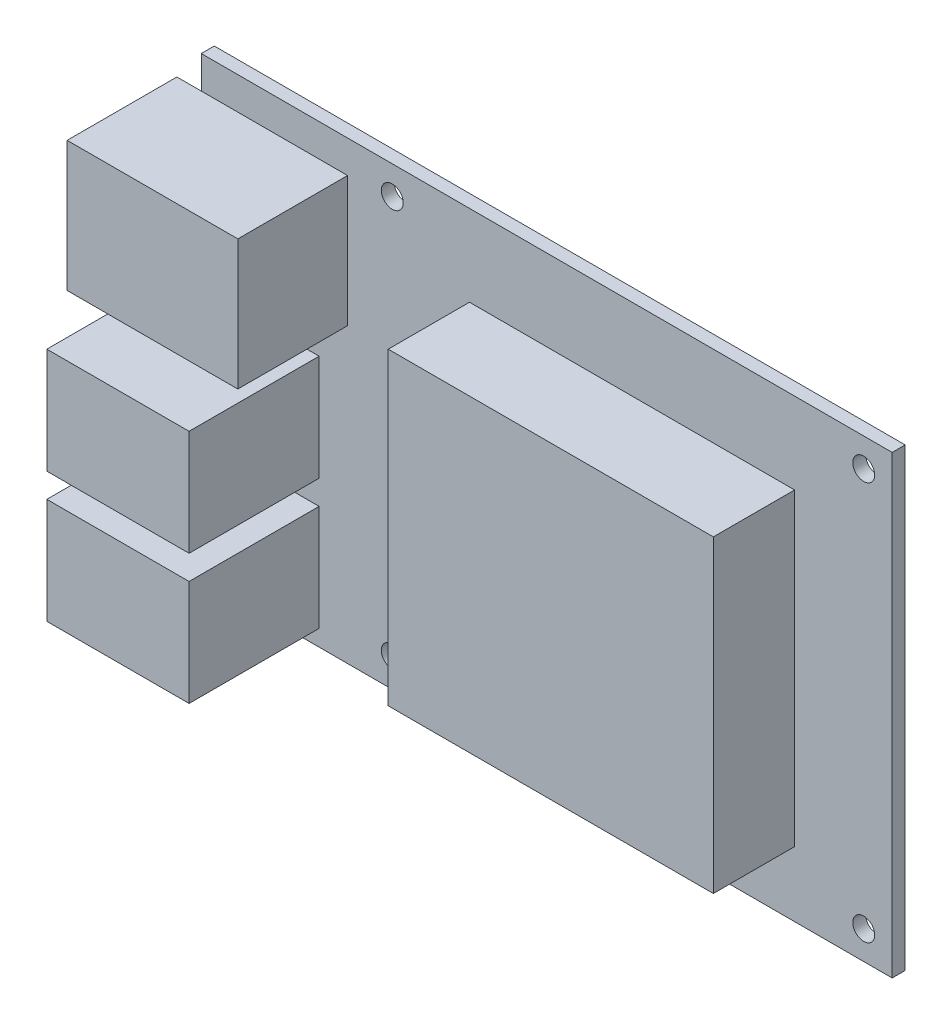
ISO-10303-21;
HEADER;
FILE_DESCRIPTION(('STEP AP214'),'2;1');
FILE_NAME('part.step','',(''),(''),'','','');
FILE_SCHEMA(('AUTOMOTIVE_DESIGN { 1 0 10303 214 1 1 1 1 }'));
ENDSEC;
DATA;
#1=APPLICATION_CONTEXT('core data for automotive mechanical design processes');
#2=APPLICATION_PROTOCOL_DEFINITION('international standard','automotive_design',2000,#1);
#3=PRODUCT_CONTEXT('',#1,'mechanical');
#4=PRODUCT('Part','Part','',(#3));
#5=PRODUCT_RELATED_PRODUCT_CATEGORY('part','',(#4));
#6=PRODUCT_DEFINITION_FORMATION('','',#4);
#7=PRODUCT_DEFINITION_CONTEXT('part definition',#1,'design');
#8=PRODUCT_DEFINITION('design','',#6,#7);
#9=PRODUCT_DEFINITION_SHAPE('','',#8);
#10=(LENGTH_UNIT() NAMED_UNIT(*) SI_UNIT(.MILLI.,.METRE.));
#11=(NAMED_UNIT(*) PLANE_ANGLE_UNIT() SI_UNIT($,.RADIAN.));
#12=(NAMED_UNIT(*) SI_UNIT($,.STERADIAN.) SOLID_ANGLE_UNIT());
#13=UNCERTAINTY_MEASURE_WITH_UNIT(LENGTH_MEASURE(1.E-05),#10,'distance_accuracy_value','');
#14=(GEOMETRIC_REPRESENTATION_CONTEXT(3) GLOBAL_UNCERTAINTY_ASSIGNED_CONTEXT((#13)) GLOBAL_UNIT_ASSIGNED_CONTEXT((#10,
#11,#12)) REPRESENTATION_CONTEXT('',''));
#15=CARTESIAN_POINT('',(0.,0.,0.));
#16=DIRECTION('',(0.,0.,1.));
#17=DIRECTION('',(1.,0.,0.));
#18=AXIS2_PLACEMENT_3D('',#15,#16,#17);
#19=CARTESIAN_POINT('',(0.,0.,-38.4));
#20=DIRECTION('',(0.,0.,-1.));
#21=DIRECTION('',(-1.,0.,0.));
#22=AXIS2_PLACEMENT_3D('',#19,#20,#21);
#23=PLANE('',#22);
#24=DIRECTION('',(1.,0.,0.));
#25=VECTOR('',#24,1.);
#26=CARTESIAN_POINT('',(-98.,-26.,-38.4));
#27=LINE('',#26,#25);
#28=CARTESIAN_POINT('',(-95.,-26.,-38.4));
#29=VERTEX_POINT('',#28);
#30=CARTESIAN_POINT('',(-80.5,-26.,-38.4));
#31=VERTEX_POINT('',#30);
#32=EDGE_CURVE('E11',#29,#31,#27,.T.);
#33=ORIENTED_EDGE('',*,*,#32,.F.);
#34=DIRECTION('',(0.,-1.,0.));
#35=VECTOR('',#34,1.);
#36=CARTESIAN_POINT('',(-95.,-28.,-38.4));
#37=LINE('',#36,#35);
#38=CARTESIAN_POINT('',(-95.,-28.,-38.4));
#39=VERTEX_POINT('',#38);
#40=EDGE_CURVE('E355',#29,#39,#37,.T.);
#41=ORIENTED_EDGE('',*,*,#40,.T.);
#42=DIRECTION('',(1.,0.,0.));
#43=VECTOR('',#42,1.);
#44=CARTESIAN_POINT('',(-95.,-28.,-38.4));
#45=LINE('',#44,#43);
#46=CARTESIAN_POINT('',(-10.,-28.,-38.4));
#47=VERTEX_POINT('',#46);
#48=EDGE_CURVE('E351',#39,#47,#45,.T.);
#49=ORIENTED_EDGE('',*,*,#48,.T.);
#50=DIRECTION('',(0.,1.,0.));
#51=VECTOR('',#50,1.);
#52=CARTESIAN_POINT('',(-10.,-28.,-38.4));
#53=LINE('',#52,#51);
#54=CARTESIAN_POINT('',(-10.,28.,-38.4));
#55=VERTEX_POINT('',#54);
#56=EDGE_CURVE('E346',#47,#55,#53,.T.);
#57=ORIENTED_EDGE('',*,*,#56,.T.);
#58=DIRECTION('',(-1.,0.,0.));
#59=VECTOR('',#58,1.);
#60=CARTESIAN_POINT('',(-95.,28.,-38.4));
#61=LINE('',#60,#59);
#62=CARTESIAN_POINT('',(-95.,28.,-38.4));
#63=VERTEX_POINT('',#62);
#64=EDGE_CURVE('E348',#55,#63,#61,.T.);
#65=ORIENTED_EDGE('',*,*,#64,.T.);
#66=CARTESIAN_POINT('',(-95.,24.,-38.4));
#67=VERTEX_POINT('',#66);
#68=EDGE_CURVE('E353',#63,#67,#37,.T.);
#69=ORIENTED_EDGE('',*,*,#68,.T.);
#70=DIRECTION('',(-1.,0.,0.));
#71=VECTOR('',#70,1.);
#72=CARTESIAN_POINT('',(-98.,24.,-38.4));
#73=LINE('',#72,#71);
#74=CARTESIAN_POINT('',(-77.,24.,-38.4));
#75=VERTEX_POINT('',#74);
#76=EDGE_CURVE('E305',#75,#67,#73,.T.);
#77=ORIENTED_EDGE('',*,*,#76,.F.);
#78=DIRECTION('',(0.,1.,0.));
#79=VECTOR('',#78,1.);
#80=CARTESIAN_POINT('',(-77.,8.,-38.4));
#81=LINE('',#80,#79);
#82=CARTESIAN_POINT('',(-77.,8.,-38.4));
#83=VERTEX_POINT('',#82);
#84=EDGE_CURVE('E260',#83,#75,#81,.T.);
#85=ORIENTED_EDGE('',*,*,#84,.F.);
#86=DIRECTION('',(1.,0.,0.));
#87=VECTOR('',#86,1.);
#88=CARTESIAN_POINT('',(-98.,8.,-38.4));
#89=LINE('',#88,#87);
#90=CARTESIAN_POINT('',(-95.,8.,-38.4));
#91=VERTEX_POINT('',#90);
#92=EDGE_CURVE('E307',#91,#83,#89,.T.);
#93=ORIENTED_EDGE('',*,*,#92,.F.);
#94=CARTESIAN_POINT('',(-95.,3.,-38.4));
#95=VERTEX_POINT('',#94);
#96=EDGE_CURVE('E408',#91,#95,#37,.T.);
#97=ORIENTED_EDGE('',*,*,#96,.T.);
#98=DIRECTION('',(-1.,0.,0.));
#99=VECTOR('',#98,1.);
#100=CARTESIAN_POINT('',(-98.,3.,-38.4));
#101=LINE('',#100,#99);
#102=CARTESIAN_POINT('',(-80.5,3.,-38.4));
#103=VERTEX_POINT('',#102);
#104=EDGE_CURVE('E279',#103,#95,#101,.T.);
#105=ORIENTED_EDGE('',*,*,#104,.F.);
#106=DIRECTION('',(0.,1.,0.));
#107=VECTOR('',#106,1.);
#108=CARTESIAN_POINT('',(-80.5,-10.,-38.4));
#109=LINE('',#108,#107);
#110=CARTESIAN_POINT('',(-80.5,-10.,-38.4));
#111=VERTEX_POINT('',#110);
#112=EDGE_CURVE('E241',#111,#103,#109,.T.);
#113=ORIENTED_EDGE('',*,*,#112,.F.);
#114=DIRECTION('',(1.,0.,0.));
#115=VECTOR('',#114,1.);
#116=CARTESIAN_POINT('',(-98.,-10.,-38.4));
#117=LINE('',#116,#115);
#118=CARTESIAN_POINT('',(-95.,-10.,-38.4));
#119=VERTEX_POINT('',#118);
#120=EDGE_CURVE('E48',#119,#111,#117,.T.);
#121=ORIENTED_EDGE('',*,*,#120,.F.);
#122=CARTESIAN_POINT('',(-95.,-13.,-38.4));
#123=VERTEX_POINT('',#122);
#124=EDGE_CURVE('E407',#119,#123,#37,.T.);
#125=ORIENTED_EDGE('',*,*,#124,.T.);
#126=DIRECTION('',(-1.,0.,0.));
#127=VECTOR('',#126,1.);
#128=CARTESIAN_POINT('',(-98.,-13.,-38.4));
#129=LINE('',#128,#127);
#130=CARTESIAN_POINT('',(-80.5,-13.,-38.4));
#131=VERTEX_POINT('',#130);
#132=EDGE_CURVE('E245',#131,#123,#129,.T.);
#133=ORIENTED_EDGE('',*,*,#132,.F.);
#134=DIRECTION('',(0.,1.,0.));
#135=VECTOR('',#134,1.);
#136=CARTESIAN_POINT('',(-80.5,-26.,-38.4));
#137=LINE('',#136,#135);
#138=EDGE_CURVE('E240',#31,#131,#137,.T.);
#139=ORIENTED_EDGE('',*,*,#138,.F.);
#140=EDGE_LOOP('',(#33,#41,#49,#57,#65,#69,#77,#85,#93,#97,#105,#113,#121,#125,#133,#139));
#141=FACE_BOUND('',#140,.T.);
#142=CARTESIAN_POINT('',(-13.5,24.5,-38.4));
#143=DIRECTION('',(0.,0.,1.));
#144=DIRECTION('',(1.,0.,0.));
#145=AXIS2_PLACEMENT_3D('',#142,#143,#144);
#146=CIRCLE('',#145,1.35);
#147=CARTESIAN_POINT('',(-12.15,24.5,-38.4));
#148=VERTEX_POINT('',#147);
#149=EDGE_CURVE('E335',#148,#148,#146,.T.);
#150=ORIENTED_EDGE('',*,*,#149,.F.);
#151=EDGE_LOOP('',(#150));
#152=FACE_BOUND('',#151,.T.);
#153=CARTESIAN_POINT('',(-71.5,-24.5,-38.4));
#154=DIRECTION('',(0.,0.,1.));
#155=DIRECTION('',(1.,0.,0.));
#156=AXIS2_PLACEMENT_3D('',#153,#154,#155);
#157=CIRCLE('',#156,1.35);
#158=CARTESIAN_POINT('',(-70.15,-24.5,-38.4));
#159=VERTEX_POINT('',#158);
#160=EDGE_CURVE('E322',#159,#159,#157,.T.);
#161=ORIENTED_EDGE('',*,*,#160,.F.);
#162=EDGE_LOOP('',(#161));
#163=FACE_BOUND('',#162,.T.);
#164=CARTESIAN_POINT('',(-71.5,24.5,-38.4));
#165=DIRECTION('',(0.,0.,1.));
#166=DIRECTION('',(1.,0.,0.));
#167=AXIS2_PLACEMENT_3D('',#164,#165,#166);
#168=CIRCLE('',#167,1.35);
#169=CARTESIAN_POINT('',(-70.15,24.5,-38.4));
#170=VERTEX_POINT('',#169);
#171=EDGE_CURVE('E324',#170,#170,#168,.T.);
#172=ORIENTED_EDGE('',*,*,#171,.F.);
#173=EDGE_LOOP('',(#172));
#174=FACE_BOUND('',#173,.T.);
#175=CARTESIAN_POINT('',(-13.5,-24.5,-38.4));
#176=DIRECTION('',(0.,0.,1.));
#177=DIRECTION('',(1.,0.,0.));
#178=AXIS2_PLACEMENT_3D('',#175,#176,#177);
#179=CIRCLE('',#178,1.35);
#180=CARTESIAN_POINT('',(-12.15,-24.5,-38.4));
#181=VERTEX_POINT('',#180);
#182=EDGE_CURVE('E338',#181,#181,#179,.T.);
#183=ORIENTED_EDGE('',*,*,#182,.F.);
#184=EDGE_LOOP('',(#183));
#185=FACE_BOUND('',#184,.T.);
#186=DIRECTION('',(0.,1.,0.));
#187=VECTOR('',#186,1.);
#188=CARTESIAN_POINT('',(-22.,-20.,-38.4));
#189=LINE('',#188,#187);
#190=CARTESIAN_POINT('',(-22.,-20.,-38.4));
#191=VERTEX_POINT('',#190);
#192=CARTESIAN_POINT('',(-22.,18.,-38.4));
#193=VERTEX_POINT('',#192);
#194=EDGE_CURVE('E217',#191,#193,#189,.T.);
#195=ORIENTED_EDGE('',*,*,#194,.F.);
#196=DIRECTION('',(1.,0.,0.));
#197=VECTOR('',#196,1.);
#198=CARTESIAN_POINT('',(-62.,-20.,-38.4));
#199=LINE('',#198,#197);
#200=CARTESIAN_POINT('',(-62.,-20.,-38.4));
#201=VERTEX_POINT('',#200);
#202=EDGE_CURVE('E213',#201,#191,#199,.T.);
#203=ORIENTED_EDGE('',*,*,#202,.F.);
#204=DIRECTION('',(0.,-1.,0.));
#205=VECTOR('',#204,1.);
#206=CARTESIAN_POINT('',(-62.,-20.,-38.4));
#207=LINE('',#206,#205);
#208=CARTESIAN_POINT('',(-62.,18.,-38.4));
#209=VERTEX_POINT('',#208);
#210=EDGE_CURVE('E61',#209,#201,#207,.T.);
#211=ORIENTED_EDGE('',*,*,#210,.F.);
#212=DIRECTION('',(-1.,0.,0.));
#213=VECTOR('',#212,1.);
#214=CARTESIAN_POINT('',(-62.,18.,-38.4));
#215=LINE('',#214,#213);
#216=EDGE_CURVE('E60',#193,#209,#215,.T.);
#217=ORIENTED_EDGE('',*,*,#216,.F.);
#218=EDGE_LOOP('',(#195,#203,#211,#217));
#219=FACE_BOUND('',#218,.T.);
#220=ADVANCED_FACE('F39',(#141,#152,#163,#174,#185,#219),#23,.F.);
#221=CARTESIAN_POINT('',(-10.,-28.,-38.4));
#222=DIRECTION('',(-1.,0.,0.));
#223=DIRECTION('',(0.,0.,1.));
#224=AXIS2_PLACEMENT_3D('',#221,#222,#223);
#225=PLANE('',#224);
#226=DIRECTION('',(0.,1.,0.));
#227=VECTOR('',#226,1.);
#228=CARTESIAN_POINT('',(-10.,-28.,-40.));
#229=LINE('',#228,#227);
#230=CARTESIAN_POINT('',(-10.,-28.,-40.));
#231=VERTEX_POINT('',#230);
#232=CARTESIAN_POINT('',(-10.,28.,-40.));
#233=VERTEX_POINT('',#232);
#234=EDGE_CURVE('E345',#231,#233,#229,.T.);
#235=ORIENTED_EDGE('',*,*,#234,.T.);
#236=DIRECTION('',(0.,0.,-1.));
#237=VECTOR('',#236,1.);
#238=CARTESIAN_POINT('',(-10.,28.,-38.4));
#239=LINE('',#238,#237);
#240=EDGE_CURVE('E43',#55,#233,#239,.T.);
#241=ORIENTED_EDGE('',*,*,#240,.F.);
#242=ORIENTED_EDGE('',*,*,#56,.F.);
#243=DIRECTION('',(0.,0.,-1.));
#244=VECTOR('',#243,1.);
#245=CARTESIAN_POINT('',(-10.,-28.,-38.4));
#246=LINE('',#245,#244);
#247=EDGE_CURVE('E356',#47,#231,#246,.T.);
#248=ORIENTED_EDGE('',*,*,#247,.T.);
#249=EDGE_LOOP('',(#235,#241,#242,#248));
#250=FACE_BOUND('',#249,.T.);
#251=ADVANCED_FACE('F41',(#250),#225,.F.);
#252=CARTESIAN_POINT('',(-95.,28.,-38.4));
#253=DIRECTION('',(0.,-1.,0.));
#254=DIRECTION('',(0.,0.,-1.));
#255=AXIS2_PLACEMENT_3D('',#252,#253,#254);
#256=PLANE('',#255);
#257=DIRECTION('',(-1.,0.,0.));
#258=VECTOR('',#257,1.);
#259=CARTESIAN_POINT('',(-95.,28.,-40.));
#260=LINE('',#259,#258);
#261=CARTESIAN_POINT('',(-95.,28.,-40.));
#262=VERTEX_POINT('',#261);
#263=EDGE_CURVE('E363',#233,#262,#260,.T.);
#264=ORIENTED_EDGE('',*,*,#263,.T.);
#265=DIRECTION('',(0.,0.,-1.));
#266=VECTOR('',#265,1.);
#267=CARTESIAN_POINT('',(-95.,28.,-38.4));
#268=LINE('',#267,#266);
#269=EDGE_CURVE('E369',#63,#262,#268,.T.);
#270=ORIENTED_EDGE('',*,*,#269,.F.);
#271=ORIENTED_EDGE('',*,*,#64,.F.);
#272=ORIENTED_EDGE('',*,*,#240,.T.);
#273=EDGE_LOOP('',(#264,#270,#271,#272));
#274=FACE_BOUND('',#273,.T.);
#275=ADVANCED_FACE('F429',(#274),#256,.F.);
#276=CARTESIAN_POINT('',(-95.,-28.,-38.4));
#277=DIRECTION('',(1.,0.,0.));
#278=DIRECTION('',(0.,0.,-1.));
#279=AXIS2_PLACEMENT_3D('',#276,#277,#278);
#280=PLANE('',#279);
#281=DIRECTION('',(0.,-1.,0.));
#282=VECTOR('',#281,1.);
#283=CARTESIAN_POINT('',(-95.,-28.,-40.));
#284=LINE('',#283,#282);
#285=CARTESIAN_POINT('',(-95.,-28.,-40.));
#286=VERTEX_POINT('',#285);
#287=EDGE_CURVE('E361',#262,#286,#284,.T.);
#288=ORIENTED_EDGE('',*,*,#287,.T.);
#289=DIRECTION('',(0.,0.,-1.));
#290=VECTOR('',#289,1.);
#291=CARTESIAN_POINT('',(-95.,-28.,-38.4));
#292=LINE('',#291,#290);
#293=EDGE_CURVE('E368',#39,#286,#292,.T.);
#294=ORIENTED_EDGE('',*,*,#293,.F.);
#295=ORIENTED_EDGE('',*,*,#40,.F.);
#296=EDGE_CURVE('E411',#123,#29,#37,.T.);
#297=ORIENTED_EDGE('',*,*,#296,.F.);
#298=ORIENTED_EDGE('',*,*,#124,.F.);
#299=EDGE_CURVE('E409',#95,#119,#37,.T.);
#300=ORIENTED_EDGE('',*,*,#299,.F.);
#301=ORIENTED_EDGE('',*,*,#96,.F.);
#302=EDGE_CURVE('E358',#67,#91,#37,.T.);
#303=ORIENTED_EDGE('',*,*,#302,.F.);
#304=ORIENTED_EDGE('',*,*,#68,.F.);
#305=ORIENTED_EDGE('',*,*,#269,.T.);
#306=EDGE_LOOP('',(#288,#294,#295,#297,#298,#300,#301,#303,#304,#305));
#307=FACE_BOUND('',#306,.T.);
#308=ADVANCED_FACE('F423',(#307),#280,.F.);
#309=CARTESIAN_POINT('',(-95.,-28.,-38.4));
#310=DIRECTION('',(0.,1.,0.));
#311=DIRECTION('',(0.,0.,1.));
#312=AXIS2_PLACEMENT_3D('',#309,#310,#311);
#313=PLANE('',#312);
#314=DIRECTION('',(1.,0.,0.));
#315=VECTOR('',#314,1.);
#316=CARTESIAN_POINT('',(-95.,-28.,-40.));
#317=LINE('',#316,#315);
#318=EDGE_CURVE('E350',#286,#231,#317,.T.);
#319=ORIENTED_EDGE('',*,*,#318,.T.);
#320=ORIENTED_EDGE('',*,*,#247,.F.);
#321=ORIENTED_EDGE('',*,*,#48,.F.);
#322=ORIENTED_EDGE('',*,*,#293,.T.);
#323=EDGE_LOOP('',(#319,#320,#321,#322));
#324=FACE_BOUND('',#323,.T.);
#325=ADVANCED_FACE('F425',(#324),#313,.F.);
#326=CARTESIAN_POINT('',(0.,0.,-40.));
#327=DIRECTION('',(0.,0.,-1.));
#328=DIRECTION('',(-1.,0.,0.));
#329=AXIS2_PLACEMENT_3D('',#326,#327,#328);
#330=PLANE('',#329);
#331=CARTESIAN_POINT('',(-13.5,24.5,-40.));
#332=DIRECTION('',(0.,0.,1.));
#333=DIRECTION('',(1.,0.,0.));
#334=AXIS2_PLACEMENT_3D('',#331,#332,#333);
#335=CIRCLE('',#334,1.35);
#336=CARTESIAN_POINT('',(-12.15,24.5,-40.));
#337=VERTEX_POINT('',#336);
#338=EDGE_CURVE('E329',#337,#337,#335,.T.);
#339=ORIENTED_EDGE('',*,*,#338,.T.);
#340=EDGE_LOOP('',(#339));
#341=FACE_BOUND('',#340,.T.);
#342=CARTESIAN_POINT('',(-71.5,-24.5,-40.));
#343=DIRECTION('',(0.,0.,1.));
#344=DIRECTION('',(1.,0.,0.));
#345=AXIS2_PLACEMENT_3D('',#342,#343,#344);
#346=CIRCLE('',#345,1.35);
#347=CARTESIAN_POINT('',(-70.15,-24.5,-40.));
#348=VERTEX_POINT('',#347);
#349=EDGE_CURVE('E331',#348,#348,#346,.T.);
#350=ORIENTED_EDGE('',*,*,#349,.T.);
#351=EDGE_LOOP('',(#350));
#352=FACE_BOUND('',#351,.T.);
#353=CARTESIAN_POINT('',(-71.5,24.5,-40.));
#354=DIRECTION('',(0.,0.,1.));
#355=DIRECTION('',(1.,0.,0.));
#356=AXIS2_PLACEMENT_3D('',#353,#354,#355);
#357=CIRCLE('',#356,1.35);
#358=CARTESIAN_POINT('',(-70.15,24.5,-40.));
#359=VERTEX_POINT('',#358);
#360=EDGE_CURVE('E321',#359,#359,#357,.T.);
#361=ORIENTED_EDGE('',*,*,#360,.T.);
#362=EDGE_LOOP('',(#361));
#363=FACE_BOUND('',#362,.T.);
#364=CARTESIAN_POINT('',(-13.5,-24.5,-40.));
#365=DIRECTION('',(0.,0.,1.));
#366=DIRECTION('',(1.,0.,0.));
#367=AXIS2_PLACEMENT_3D('',#364,#365,#366);
#368=CIRCLE('',#367,1.35);
#369=CARTESIAN_POINT('',(-12.15,-24.5,-40.));
#370=VERTEX_POINT('',#369);
#371=EDGE_CURVE('E332',#370,#370,#368,.T.);
#372=ORIENTED_EDGE('',*,*,#371,.T.);
#373=EDGE_LOOP('',(#372));
#374=FACE_BOUND('',#373,.T.);
#375=ORIENTED_EDGE('',*,*,#234,.F.);
#376=ORIENTED_EDGE('',*,*,#318,.F.);
#377=ORIENTED_EDGE('',*,*,#287,.F.);
#378=ORIENTED_EDGE('',*,*,#263,.F.);
#379=EDGE_LOOP('',(#375,#376,#377,#378));
#380=FACE_BOUND('',#379,.T.);
#381=ADVANCED_FACE('F468',(#341,#352,#363,#374,#380),#330,.T.);
#382=CARTESIAN_POINT('',(-13.5,-24.5,-38.4));
#383=DIRECTION('',(0.,0.,-1.));
#384=DIRECTION('',(-1.,0.,0.));
#385=AXIS2_PLACEMENT_3D('',#382,#383,#384);
#386=CYLINDRICAL_SURFACE('',#385,1.35);
#387=ORIENTED_EDGE('',*,*,#182,.T.);
#388=EDGE_LOOP('',(#387));
#389=FACE_BOUND('',#388,.T.);
#390=ORIENTED_EDGE('',*,*,#371,.F.);
#391=EDGE_LOOP('',(#390));
#392=FACE_BOUND('',#391,.T.);
#393=ADVANCED_FACE('F466',(#389,#392),#386,.F.);
#394=CARTESIAN_POINT('',(-71.5,24.5,-38.4));
#395=DIRECTION('',(0.,0.,-1.));
#396=DIRECTION('',(-1.,0.,0.));
#397=AXIS2_PLACEMENT_3D('',#394,#395,#396);
#398=CYLINDRICAL_SURFACE('',#397,1.35);
#399=ORIENTED_EDGE('',*,*,#171,.T.);
#400=EDGE_LOOP('',(#399));
#401=FACE_BOUND('',#400,.T.);
#402=ORIENTED_EDGE('',*,*,#360,.F.);
#403=EDGE_LOOP('',(#402));
#404=FACE_BOUND('',#403,.T.);
#405=ADVANCED_FACE('F499',(#401,#404),#398,.F.);
#406=CARTESIAN_POINT('',(-71.5,-24.5,-38.4));
#407=DIRECTION('',(0.,0.,-1.));
#408=DIRECTION('',(-1.,0.,0.));
#409=AXIS2_PLACEMENT_3D('',#406,#407,#408);
#410=CYLINDRICAL_SURFACE('',#409,1.35);
#411=ORIENTED_EDGE('',*,*,#160,.T.);
#412=EDGE_LOOP('',(#411));
#413=FACE_BOUND('',#412,.T.);
#414=ORIENTED_EDGE('',*,*,#349,.F.);
#415=EDGE_LOOP('',(#414));
#416=FACE_BOUND('',#415,.T.);
#417=ADVANCED_FACE('F507',(#413,#416),#410,.F.);
#418=CARTESIAN_POINT('',(-13.5,24.5,-38.4));
#419=DIRECTION('',(0.,0.,-1.));
#420=DIRECTION('',(-1.,0.,0.));
#421=AXIS2_PLACEMENT_3D('',#418,#419,#420);
#422=CYLINDRICAL_SURFACE('',#421,1.35);
#423=ORIENTED_EDGE('',*,*,#149,.T.);
#424=EDGE_LOOP('',(#423));
#425=FACE_BOUND('',#424,.T.);
#426=ORIENTED_EDGE('',*,*,#338,.F.);
#427=EDGE_LOOP('',(#426));
#428=FACE_BOUND('',#427,.T.);
#429=ADVANCED_FACE('F516',(#425,#428),#422,.F.);
#430=CARTESIAN_POINT('',(-77.,8.,-24.9));
#431=DIRECTION('',(-1.,0.,0.));
#432=DIRECTION('',(0.,0.,1.));
#433=AXIS2_PLACEMENT_3D('',#430,#431,#432);
#434=PLANE('',#433);
#435=ORIENTED_EDGE('',*,*,#84,.T.);
#436=DIRECTION('',(0.,0.,-1.));
#437=VECTOR('',#436,1.);
#438=CARTESIAN_POINT('',(-77.,24.,-24.9));
#439=LINE('',#438,#437);
#440=CARTESIAN_POINT('',(-77.,24.,-24.9));
#441=VERTEX_POINT('',#440);
#442=EDGE_CURVE('E319',#441,#75,#439,.T.);
#443=ORIENTED_EDGE('',*,*,#442,.F.);
#444=DIRECTION('',(0.,1.,0.));
#445=VECTOR('',#444,1.);
#446=CARTESIAN_POINT('',(-77.,8.,-24.9));
#447=LINE('',#446,#445);
#448=CARTESIAN_POINT('',(-77.,8.,-24.9));
#449=VERTEX_POINT('',#448);
#450=EDGE_CURVE('E288',#449,#441,#447,.T.);
#451=ORIENTED_EDGE('',*,*,#450,.F.);
#452=DIRECTION('',(0.,0.,-1.));
#453=VECTOR('',#452,1.);
#454=CARTESIAN_POINT('',(-77.,8.,-24.9));
#455=LINE('',#454,#453);
#456=EDGE_CURVE('E296',#449,#83,#455,.T.);
#457=ORIENTED_EDGE('',*,*,#456,.T.);
#458=EDGE_LOOP('',(#435,#443,#451,#457));
#459=FACE_BOUND('',#458,.T.);
#460=ADVANCED_FACE('F441',(#459),#434,.F.);
#461=CARTESIAN_POINT('',(-98.,24.,-24.9));
#462=DIRECTION('',(0.,-1.,0.));
#463=DIRECTION('',(0.,0.,-1.));
#464=AXIS2_PLACEMENT_3D('',#461,#462,#463);
#465=PLANE('',#464);
#466=ORIENTED_EDGE('',*,*,#76,.T.);
#467=CARTESIAN_POINT('',(-98.,24.,-38.4));
#468=VERTEX_POINT('',#467);
#469=EDGE_CURVE('E301',#67,#468,#73,.T.);
#470=ORIENTED_EDGE('',*,*,#469,.T.);
#471=DIRECTION('',(0.,0.,-1.));
#472=VECTOR('',#471,1.);
#473=CARTESIAN_POINT('',(-98.,24.,-24.9));
#474=LINE('',#473,#472);
#475=CARTESIAN_POINT('',(-98.,24.,-24.9));
#476=VERTEX_POINT('',#475);
#477=EDGE_CURVE('E314',#476,#468,#474,.T.);
#478=ORIENTED_EDGE('',*,*,#477,.F.);
#479=DIRECTION('',(-1.,0.,0.));
#480=VECTOR('',#479,1.);
#481=CARTESIAN_POINT('',(-98.,24.,-24.9));
#482=LINE('',#481,#480);
#483=EDGE_CURVE('E293',#441,#476,#482,.T.);
#484=ORIENTED_EDGE('',*,*,#483,.F.);
#485=ORIENTED_EDGE('',*,*,#442,.T.);
#486=EDGE_LOOP('',(#466,#470,#478,#484,#485));
#487=FACE_BOUND('',#486,.T.);
#488=ADVANCED_FACE('F438',(#487),#465,.F.);
#489=CARTESIAN_POINT('',(-98.,8.,-24.9));
#490=DIRECTION('',(1.,0.,0.));
#491=DIRECTION('',(0.,0.,-1.));
#492=AXIS2_PLACEMENT_3D('',#489,#490,#491);
#493=PLANE('',#492);
#494=DIRECTION('',(0.,-1.,0.));
#495=VECTOR('',#494,1.);
#496=CARTESIAN_POINT('',(-98.,8.,-38.4));
#497=LINE('',#496,#495);
#498=CARTESIAN_POINT('',(-98.,8.,-38.4));
#499=VERTEX_POINT('',#498);
#500=EDGE_CURVE('E304',#468,#499,#497,.T.);
#501=ORIENTED_EDGE('',*,*,#500,.T.);
#502=DIRECTION('',(0.,0.,-1.));
#503=VECTOR('',#502,1.);
#504=CARTESIAN_POINT('',(-98.,8.,-24.9));
#505=LINE('',#504,#503);
#506=CARTESIAN_POINT('',(-98.,8.,-24.9));
#507=VERTEX_POINT('',#506);
#508=EDGE_CURVE('E315',#507,#499,#505,.T.);
#509=ORIENTED_EDGE('',*,*,#508,.F.);
#510=DIRECTION('',(0.,-1.,0.));
#511=VECTOR('',#510,1.);
#512=CARTESIAN_POINT('',(-98.,8.,-24.9));
#513=LINE('',#512,#511);
#514=EDGE_CURVE('E295',#476,#507,#513,.T.);
#515=ORIENTED_EDGE('',*,*,#514,.F.);
#516=ORIENTED_EDGE('',*,*,#477,.T.);
#517=EDGE_LOOP('',(#501,#509,#515,#516));
#518=FACE_BOUND('',#517,.T.);
#519=ADVANCED_FACE('F448',(#518),#493,.F.);
#520=CARTESIAN_POINT('',(-98.,8.,-24.9));
#521=DIRECTION('',(0.,1.,0.));
#522=DIRECTION('',(0.,0.,1.));
#523=AXIS2_PLACEMENT_3D('',#520,#521,#522);
#524=PLANE('',#523);
#525=EDGE_CURVE('E292',#499,#91,#89,.T.);
#526=ORIENTED_EDGE('',*,*,#525,.T.);
#527=ORIENTED_EDGE('',*,*,#92,.T.);
#528=ORIENTED_EDGE('',*,*,#456,.F.);
#529=DIRECTION('',(1.,0.,0.));
#530=VECTOR('',#529,1.);
#531=CARTESIAN_POINT('',(-98.,8.,-24.9));
#532=LINE('',#531,#530);
#533=EDGE_CURVE('E298',#507,#449,#532,.T.);
#534=ORIENTED_EDGE('',*,*,#533,.F.);
#535=ORIENTED_EDGE('',*,*,#508,.T.);
#536=EDGE_LOOP('',(#526,#527,#528,#534,#535));
#537=FACE_BOUND('',#536,.T.);
#538=ADVANCED_FACE('F443',(#537),#524,.F.);
#539=CARTESIAN_POINT('',(0.,0.,-24.9));
#540=DIRECTION('',(0.,0.,-1.));
#541=DIRECTION('',(-1.,0.,0.));
#542=AXIS2_PLACEMENT_3D('',#539,#540,#541);
#543=PLANE('',#542);
#544=ORIENTED_EDGE('',*,*,#450,.T.);
#545=ORIENTED_EDGE('',*,*,#483,.T.);
#546=ORIENTED_EDGE('',*,*,#514,.T.);
#547=ORIENTED_EDGE('',*,*,#533,.T.);
#548=EDGE_LOOP('',(#544,#545,#546,#547));
#549=FACE_BOUND('',#548,.T.);
#550=ADVANCED_FACE('F450',(#549),#543,.F.);
#551=CARTESIAN_POINT('',(0.,0.,-38.4));
#552=DIRECTION('',(0.,0.,-1.));
#553=DIRECTION('',(-1.,0.,0.));
#554=AXIS2_PLACEMENT_3D('',#551,#552,#553);
#555=PLANE('',#554);
#556=ORIENTED_EDGE('',*,*,#469,.F.);
#557=ORIENTED_EDGE('',*,*,#302,.T.);
#558=ORIENTED_EDGE('',*,*,#525,.F.);
#559=ORIENTED_EDGE('',*,*,#500,.F.);
#560=EDGE_LOOP('',(#556,#557,#558,#559));
#561=FACE_BOUND('',#560,.T.);
#562=ADVANCED_FACE('F434',(#561),#555,.T.);
#563=CARTESIAN_POINT('',(-80.5,-10.,-22.4));
#564=DIRECTION('',(-1.,0.,0.));
#565=DIRECTION('',(0.,0.,1.));
#566=AXIS2_PLACEMENT_3D('',#563,#564,#565);
#567=PLANE('',#566);
#568=ORIENTED_EDGE('',*,*,#112,.T.);
#569=DIRECTION('',(0.,0.,-1.));
#570=VECTOR('',#569,1.);
#571=CARTESIAN_POINT('',(-80.5,3.,-22.4));
#572=LINE('',#571,#570);
#573=CARTESIAN_POINT('',(-80.5,3.,-22.4));
#574=VERTEX_POINT('',#573);
#575=EDGE_CURVE('E219',#574,#103,#572,.T.);
#576=ORIENTED_EDGE('',*,*,#575,.F.);
#577=DIRECTION('',(0.,1.,0.));
#578=VECTOR('',#577,1.);
#579=CARTESIAN_POINT('',(-80.5,-10.,-22.4));
#580=LINE('',#579,#578);
#581=CARTESIAN_POINT('',(-80.5,-10.,-22.4));
#582=VERTEX_POINT('',#581);
#583=EDGE_CURVE('E271',#582,#574,#580,.T.);
#584=ORIENTED_EDGE('',*,*,#583,.F.);
#585=DIRECTION('',(0.,0.,-1.));
#586=VECTOR('',#585,1.);
#587=CARTESIAN_POINT('',(-80.5,-10.,-22.4));
#588=LINE('',#587,#586);
#589=EDGE_CURVE('E265',#582,#111,#588,.T.);
#590=ORIENTED_EDGE('',*,*,#589,.T.);
#591=EDGE_LOOP('',(#568,#576,#584,#590));
#592=FACE_BOUND('',#591,.T.);
#593=ADVANCED_FACE('F394',(#592),#567,.F.);
#594=CARTESIAN_POINT('',(-98.,3.,-22.4));
#595=DIRECTION('',(0.,-1.,0.));
#596=DIRECTION('',(0.,0.,-1.));
#597=AXIS2_PLACEMENT_3D('',#594,#595,#596);
#598=PLANE('',#597);
#599=ORIENTED_EDGE('',*,*,#104,.T.);
#600=CARTESIAN_POINT('',(-98.,3.,-38.4));
#601=VERTEX_POINT('',#600);
#602=EDGE_CURVE('E273',#95,#601,#101,.T.);
#603=ORIENTED_EDGE('',*,*,#602,.T.);
#604=DIRECTION('',(0.,0.,-1.));
#605=VECTOR('',#604,1.);
#606=CARTESIAN_POINT('',(-98.,3.,-22.4));
#607=LINE('',#606,#605);
#608=CARTESIAN_POINT('',(-98.,3.,-22.4));
#609=VERTEX_POINT('',#608);
#610=EDGE_CURVE('E222',#609,#601,#607,.T.);
#611=ORIENTED_EDGE('',*,*,#610,.F.);
#612=DIRECTION('',(-1.,0.,0.));
#613=VECTOR('',#612,1.);
#614=CARTESIAN_POINT('',(-98.,3.,-22.4));
#615=LINE('',#614,#613);
#616=EDGE_CURVE('E283',#574,#609,#615,.T.);
#617=ORIENTED_EDGE('',*,*,#616,.F.);
#618=ORIENTED_EDGE('',*,*,#575,.T.);
#619=EDGE_LOOP('',(#599,#603,#611,#617,#618));
#620=FACE_BOUND('',#619,.T.);
#621=ADVANCED_FACE('F573',(#620),#598,.F.);
#622=CARTESIAN_POINT('',(-98.,-10.,-22.4));
#623=DIRECTION('',(1.,0.,0.));
#624=DIRECTION('',(0.,0.,-1.));
#625=AXIS2_PLACEMENT_3D('',#622,#623,#624);
#626=PLANE('',#625);
#627=DIRECTION('',(0.,-1.,0.));
#628=VECTOR('',#627,1.);
#629=CARTESIAN_POINT('',(-98.,-10.,-38.4));
#630=LINE('',#629,#628);
#631=CARTESIAN_POINT('',(-98.,-10.,-38.4));
#632=VERTEX_POINT('',#631);
#633=EDGE_CURVE('E275',#601,#632,#630,.T.);
#634=ORIENTED_EDGE('',*,*,#633,.T.);
#635=DIRECTION('',(0.,0.,-1.));
#636=VECTOR('',#635,1.);
#637=CARTESIAN_POINT('',(-98.,-10.,-22.4));
#638=LINE('',#637,#636);
#639=CARTESIAN_POINT('',(-98.,-10.,-22.4));
#640=VERTEX_POINT('',#639);
#641=EDGE_CURVE('E262',#640,#632,#638,.T.);
#642=ORIENTED_EDGE('',*,*,#641,.F.);
#643=DIRECTION('',(0.,-1.,0.));
#644=VECTOR('',#643,1.);
#645=CARTESIAN_POINT('',(-98.,-10.,-22.4));
#646=LINE('',#645,#644);
#647=EDGE_CURVE('E282',#609,#640,#646,.T.);
#648=ORIENTED_EDGE('',*,*,#647,.F.);
#649=ORIENTED_EDGE('',*,*,#610,.T.);
#650=EDGE_LOOP('',(#634,#642,#648,#649));
#651=FACE_BOUND('',#650,.T.);
#652=ADVANCED_FACE('F585',(#651),#626,.F.);
#653=CARTESIAN_POINT('',(-98.,-10.,-22.4));
#654=DIRECTION('',(0.,1.,0.));
#655=DIRECTION('',(0.,0.,1.));
#656=AXIS2_PLACEMENT_3D('',#653,#654,#655);
#657=PLANE('',#656);
#658=EDGE_CURVE('E269',#632,#119,#117,.T.);
#659=ORIENTED_EDGE('',*,*,#658,.T.);
#660=ORIENTED_EDGE('',*,*,#120,.T.);
#661=ORIENTED_EDGE('',*,*,#589,.F.);
#662=DIRECTION('',(1.,0.,0.));
#663=VECTOR('',#662,1.);
#664=CARTESIAN_POINT('',(-98.,-10.,-22.4));
#665=LINE('',#664,#663);
#666=EDGE_CURVE('E268',#640,#582,#665,.T.);
#667=ORIENTED_EDGE('',*,*,#666,.F.);
#668=ORIENTED_EDGE('',*,*,#641,.T.);
#669=EDGE_LOOP('',(#659,#660,#661,#667,#668));
#670=FACE_BOUND('',#669,.T.);
#671=ADVANCED_FACE('F383',(#670),#657,.F.);
#672=CARTESIAN_POINT('',(0.,0.,-22.4));
#673=DIRECTION('',(0.,0.,-1.));
#674=DIRECTION('',(-1.,0.,0.));
#675=AXIS2_PLACEMENT_3D('',#672,#673,#674);
#676=PLANE('',#675);
#677=ORIENTED_EDGE('',*,*,#583,.T.);
#678=ORIENTED_EDGE('',*,*,#616,.T.);
#679=ORIENTED_EDGE('',*,*,#647,.T.);
#680=ORIENTED_EDGE('',*,*,#666,.T.);
#681=EDGE_LOOP('',(#677,#678,#679,#680));
#682=FACE_BOUND('',#681,.T.);
#683=ADVANCED_FACE('F397',(#682),#676,.F.);
#684=CARTESIAN_POINT('',(0.,0.,-38.4));
#685=DIRECTION('',(0.,0.,-1.));
#686=DIRECTION('',(-1.,0.,0.));
#687=AXIS2_PLACEMENT_3D('',#684,#685,#686);
#688=PLANE('',#687);
#689=ORIENTED_EDGE('',*,*,#602,.F.);
#690=ORIENTED_EDGE('',*,*,#299,.T.);
#691=ORIENTED_EDGE('',*,*,#658,.F.);
#692=ORIENTED_EDGE('',*,*,#633,.F.);
#693=EDGE_LOOP('',(#689,#690,#691,#692));
#694=FACE_BOUND('',#693,.T.);
#695=ADVANCED_FACE('F403',(#694),#688,.T.);
#696=CARTESIAN_POINT('',(-80.5,-26.,-22.4));
#697=DIRECTION('',(-1.,0.,0.));
#698=DIRECTION('',(0.,0.,1.));
#699=AXIS2_PLACEMENT_3D('',#696,#697,#698);
#700=PLANE('',#699);
#701=ORIENTED_EDGE('',*,*,#138,.T.);
#702=DIRECTION('',(0.,0.,-1.));
#703=VECTOR('',#702,1.);
#704=CARTESIAN_POINT('',(-80.5,-13.,-22.4));
#705=LINE('',#704,#703);
#706=CARTESIAN_POINT('',(-80.5,-13.,-22.4));
#707=VERTEX_POINT('',#706);
#708=EDGE_CURVE('E259',#707,#131,#705,.T.);
#709=ORIENTED_EDGE('',*,*,#708,.F.);
#710=DIRECTION('',(0.,1.,0.));
#711=VECTOR('',#710,1.);
#712=CARTESIAN_POINT('',(-80.5,-26.,-22.4));
#713=LINE('',#712,#711);
#714=CARTESIAN_POINT('',(-80.5,-26.,-22.4));
#715=VERTEX_POINT('',#714);
#716=EDGE_CURVE('E227',#715,#707,#713,.T.);
#717=ORIENTED_EDGE('',*,*,#716,.F.);
#718=DIRECTION('',(0.,0.,-1.));
#719=VECTOR('',#718,1.);
#720=CARTESIAN_POINT('',(-80.5,-26.,-22.4));
#721=LINE('',#720,#719);
#722=EDGE_CURVE('E236',#715,#31,#721,.T.);
#723=ORIENTED_EDGE('',*,*,#722,.T.);
#724=EDGE_LOOP('',(#701,#709,#717,#723));
#725=FACE_BOUND('',#724,.T.);
#726=ADVANCED_FACE('F617',(#725),#700,.F.);
#727=CARTESIAN_POINT('',(-98.,-13.,-22.4));
#728=DIRECTION('',(0.,-1.,0.));
#729=DIRECTION('',(0.,0.,-1.));
#730=AXIS2_PLACEMENT_3D('',#727,#728,#729);
#731=PLANE('',#730);
#732=ORIENTED_EDGE('',*,*,#132,.T.);
#733=CARTESIAN_POINT('',(-98.,-13.,-38.4));
#734=VERTEX_POINT('',#733);
#735=EDGE_CURVE('E239',#123,#734,#129,.T.);
#736=ORIENTED_EDGE('',*,*,#735,.T.);
#737=DIRECTION('',(0.,0.,-1.));
#738=VECTOR('',#737,1.);
#739=CARTESIAN_POINT('',(-98.,-13.,-22.4));
#740=LINE('',#739,#738);
#741=CARTESIAN_POINT('',(-98.,-13.,-22.4));
#742=VERTEX_POINT('',#741);
#743=EDGE_CURVE('E254',#742,#734,#740,.T.);
#744=ORIENTED_EDGE('',*,*,#743,.F.);
#745=DIRECTION('',(-1.,0.,0.));
#746=VECTOR('',#745,1.);
#747=CARTESIAN_POINT('',(-98.,-13.,-22.4));
#748=LINE('',#747,#746);
#749=EDGE_CURVE('E229',#707,#742,#748,.T.);
#750=ORIENTED_EDGE('',*,*,#749,.F.);
#751=ORIENTED_EDGE('',*,*,#708,.T.);
#752=EDGE_LOOP('',(#732,#736,#744,#750,#751));
#753=FACE_BOUND('',#752,.T.);
#754=ADVANCED_FACE('F626',(#753),#731,.F.);
#755=CARTESIAN_POINT('',(-98.,-26.,-22.4));
#756=DIRECTION('',(1.,0.,0.));
#757=DIRECTION('',(0.,0.,-1.));
#758=AXIS2_PLACEMENT_3D('',#755,#756,#757);
#759=PLANE('',#758);
#760=DIRECTION('',(0.,-1.,0.));
#761=VECTOR('',#760,1.);
#762=CARTESIAN_POINT('',(-98.,-26.,-38.4));
#763=LINE('',#762,#761);
#764=CARTESIAN_POINT('',(-98.,-26.,-38.4));
#765=VERTEX_POINT('',#764);
#766=EDGE_CURVE('E244',#734,#765,#763,.T.);
#767=ORIENTED_EDGE('',*,*,#766,.T.);
#768=DIRECTION('',(0.,0.,-1.));
#769=VECTOR('',#768,1.);
#770=CARTESIAN_POINT('',(-98.,-26.,-22.4));
#771=LINE('',#770,#769);
#772=CARTESIAN_POINT('',(-98.,-26.,-22.4));
#773=VERTEX_POINT('',#772);
#774=EDGE_CURVE('E249',#773,#765,#771,.T.);
#775=ORIENTED_EDGE('',*,*,#774,.F.);
#776=DIRECTION('',(0.,-1.,0.));
#777=VECTOR('',#776,1.);
#778=CARTESIAN_POINT('',(-98.,-26.,-22.4));
#779=LINE('',#778,#777);
#780=EDGE_CURVE('E235',#742,#773,#779,.T.);
#781=ORIENTED_EDGE('',*,*,#780,.F.);
#782=ORIENTED_EDGE('',*,*,#743,.T.);
#783=EDGE_LOOP('',(#767,#775,#781,#782));
#784=FACE_BOUND('',#783,.T.);
#785=ADVANCED_FACE('F636',(#784),#759,.F.);
#786=CARTESIAN_POINT('',(-98.,-26.,-22.4));
#787=DIRECTION('',(0.,1.,0.));
#788=DIRECTION('',(0.,0.,1.));
#789=AXIS2_PLACEMENT_3D('',#786,#787,#788);
#790=PLANE('',#789);
#791=EDGE_CURVE('E49',#765,#29,#27,.T.);
#792=ORIENTED_EDGE('',*,*,#791,.T.);
#793=ORIENTED_EDGE('',*,*,#32,.T.);
#794=ORIENTED_EDGE('',*,*,#722,.F.);
#795=DIRECTION('',(1.,0.,0.));
#796=VECTOR('',#795,1.);
#797=CARTESIAN_POINT('',(-98.,-26.,-22.4));
#798=LINE('',#797,#796);
#799=EDGE_CURVE('E234',#773,#715,#798,.T.);
#800=ORIENTED_EDGE('',*,*,#799,.F.);
#801=ORIENTED_EDGE('',*,*,#774,.T.);
#802=EDGE_LOOP('',(#792,#793,#794,#800,#801));
#803=FACE_BOUND('',#802,.T.);
#804=ADVANCED_FACE('F649',(#803),#790,.F.);
#805=CARTESIAN_POINT('',(0.,0.,-22.4));
#806=DIRECTION('',(0.,0.,-1.));
#807=DIRECTION('',(-1.,0.,0.));
#808=AXIS2_PLACEMENT_3D('',#805,#806,#807);
#809=PLANE('',#808);
#810=ORIENTED_EDGE('',*,*,#716,.T.);
#811=ORIENTED_EDGE('',*,*,#749,.T.);
#812=ORIENTED_EDGE('',*,*,#780,.T.);
#813=ORIENTED_EDGE('',*,*,#799,.T.);
#814=EDGE_LOOP('',(#810,#811,#812,#813));
#815=FACE_BOUND('',#814,.T.);
#816=ADVANCED_FACE('F657',(#815),#809,.F.);
#817=CARTESIAN_POINT('',(0.,0.,-38.4));
#818=DIRECTION('',(0.,0.,-1.));
#819=DIRECTION('',(-1.,0.,0.));
#820=AXIS2_PLACEMENT_3D('',#817,#818,#819);
#821=PLANE('',#820);
#822=ORIENTED_EDGE('',*,*,#735,.F.);
#823=ORIENTED_EDGE('',*,*,#296,.T.);
#824=ORIENTED_EDGE('',*,*,#791,.F.);
#825=ORIENTED_EDGE('',*,*,#766,.F.);
#826=EDGE_LOOP('',(#822,#823,#824,#825));
#827=FACE_BOUND('',#826,.T.);
#828=ADVANCED_FACE('F669',(#827),#821,.T.);
#829=CARTESIAN_POINT('',(-22.,-20.,-28.4));
#830=DIRECTION('',(-1.,0.,0.));
#831=DIRECTION('',(0.,0.,1.));
#832=AXIS2_PLACEMENT_3D('',#829,#830,#831);
#833=PLANE('',#832);
#834=ORIENTED_EDGE('',*,*,#194,.T.);
#835=DIRECTION('',(0.,0.,-1.));
#836=VECTOR('',#835,1.);
#837=CARTESIAN_POINT('',(-22.,18.,-28.4));
#838=LINE('',#837,#836);
#839=CARTESIAN_POINT('',(-22.,18.,-28.4));
#840=VERTEX_POINT('',#839);
#841=EDGE_CURVE('E199',#840,#193,#838,.T.);
#842=ORIENTED_EDGE('',*,*,#841,.F.);
#843=DIRECTION('',(0.,1.,0.));
#844=VECTOR('',#843,1.);
#845=CARTESIAN_POINT('',(-22.,-20.,-28.4));
#846=LINE('',#845,#844);
#847=CARTESIAN_POINT('',(-22.,-20.,-28.4));
#848=VERTEX_POINT('',#847);
#849=EDGE_CURVE('E201',#848,#840,#846,.T.);
#850=ORIENTED_EDGE('',*,*,#849,.F.);
#851=DIRECTION('',(0.,0.,-1.));
#852=VECTOR('',#851,1.);
#853=CARTESIAN_POINT('',(-22.,-20.,-28.4));
#854=LINE('',#853,#852);
#855=EDGE_CURVE('E727',#848,#191,#854,.T.);
#856=ORIENTED_EDGE('',*,*,#855,.T.);
#857=EDGE_LOOP('',(#834,#842,#850,#856));
#858=FACE_BOUND('',#857,.T.);
#859=ADVANCED_FACE('F216',(#858),#833,.F.);
#860=CARTESIAN_POINT('',(-62.,18.,-28.4));
#861=DIRECTION('',(0.,-1.,0.));
#862=DIRECTION('',(0.,0.,-1.));
#863=AXIS2_PLACEMENT_3D('',#860,#861,#862);
#864=PLANE('',#863);
#865=ORIENTED_EDGE('',*,*,#216,.T.);
#866=DIRECTION('',(0.,0.,-1.));
#867=VECTOR('',#866,1.);
#868=CARTESIAN_POINT('',(-62.,18.,-28.4));
#869=LINE('',#868,#867);
#870=CARTESIAN_POINT('',(-62.,18.,-28.4));
#871=VERTEX_POINT('',#870);
#872=EDGE_CURVE('E202',#871,#209,#869,.T.);
#873=ORIENTED_EDGE('',*,*,#872,.F.);
#874=DIRECTION('',(-1.,0.,0.));
#875=VECTOR('',#874,1.);
#876=CARTESIAN_POINT('',(-62.,18.,-28.4));
#877=LINE('',#876,#875);
#878=EDGE_CURVE('E193',#840,#871,#877,.T.);
#879=ORIENTED_EDGE('',*,*,#878,.F.);
#880=ORIENTED_EDGE('',*,*,#841,.T.);
#881=EDGE_LOOP('',(#865,#873,#879,#880));
#882=FACE_BOUND('',#881,.T.);
#883=ADVANCED_FACE('F196',(#882),#864,.F.);
#884=CARTESIAN_POINT('',(-62.,-20.,-28.4));
#885=DIRECTION('',(1.,0.,0.));
#886=DIRECTION('',(0.,0.,-1.));
#887=AXIS2_PLACEMENT_3D('',#884,#885,#886);
#888=PLANE('',#887);
#889=ORIENTED_EDGE('',*,*,#210,.T.);
#890=DIRECTION('',(0.,0.,-1.));
#891=VECTOR('',#890,1.);
#892=CARTESIAN_POINT('',(-62.,-20.,-28.4));
#893=LINE('',#892,#891);
#894=CARTESIAN_POINT('',(-62.,-20.,-28.4));
#895=VERTEX_POINT('',#894);
#896=EDGE_CURVE('E223',#895,#201,#893,.T.);
#897=ORIENTED_EDGE('',*,*,#896,.F.);
#898=DIRECTION('',(0.,-1.,0.));
#899=VECTOR('',#898,1.);
#900=CARTESIAN_POINT('',(-62.,-20.,-28.4));
#901=LINE('',#900,#899);
#902=EDGE_CURVE('E204',#871,#895,#901,.T.);
#903=ORIENTED_EDGE('',*,*,#902,.F.);
#904=ORIENTED_EDGE('',*,*,#872,.T.);
#905=EDGE_LOOP('',(#889,#897,#903,#904));
#906=FACE_BOUND('',#905,.T.);
#907=ADVANCED_FACE('F692',(#906),#888,.F.);
#908=CARTESIAN_POINT('',(-62.,-20.,-28.4));
#909=DIRECTION('',(0.,1.,0.));
#910=DIRECTION('',(0.,0.,1.));
#911=AXIS2_PLACEMENT_3D('',#908,#909,#910);
#912=PLANE('',#911);
#913=ORIENTED_EDGE('',*,*,#202,.T.);
#914=ORIENTED_EDGE('',*,*,#855,.F.);
#915=DIRECTION('',(1.,0.,0.));
#916=VECTOR('',#915,1.);
#917=CARTESIAN_POINT('',(-62.,-20.,-28.4));
#918=LINE('',#917,#916);
#919=EDGE_CURVE('E208',#895,#848,#918,.T.);
#920=ORIENTED_EDGE('',*,*,#919,.F.);
#921=ORIENTED_EDGE('',*,*,#896,.T.);
#922=EDGE_LOOP('',(#913,#914,#920,#921));
#923=FACE_BOUND('',#922,.T.);
#924=ADVANCED_FACE('F702',(#923),#912,.F.);
#925=CARTESIAN_POINT('',(0.,0.,-28.4));
#926=DIRECTION('',(0.,0.,-1.));
#927=DIRECTION('',(-1.,0.,0.));
#928=AXIS2_PLACEMENT_3D('',#925,#926,#927);
#929=PLANE('',#928);
#930=ORIENTED_EDGE('',*,*,#849,.T.);
#931=ORIENTED_EDGE('',*,*,#878,.T.);
#932=ORIENTED_EDGE('',*,*,#902,.T.);
#933=ORIENTED_EDGE('',*,*,#919,.T.);
#934=EDGE_LOOP('',(#930,#931,#932,#933));
#935=FACE_BOUND('',#934,.T.);
#936=ADVANCED_FACE('F206',(#935),#929,.F.);
#937=CLOSED_SHELL('',(#220,#251,#275,#308,#325,#381,#393,#405,#417,#429,#460,#488,#519,#538,
#550,#562,#593,#621,#652,#671,#683,#695,#726,#754,#785,#804,#816,#828,#859,#883,#907,#924,#936));
#938=MANIFOLD_SOLID_BREP('B2',#937);
#939=ADVANCED_BREP_SHAPE_REPRESENTATION('',(#18,#938),#14);
#940=SHAPE_DEFINITION_REPRESENTATION(#9,#939);
ENDSEC;
END-ISO-10303-21;
